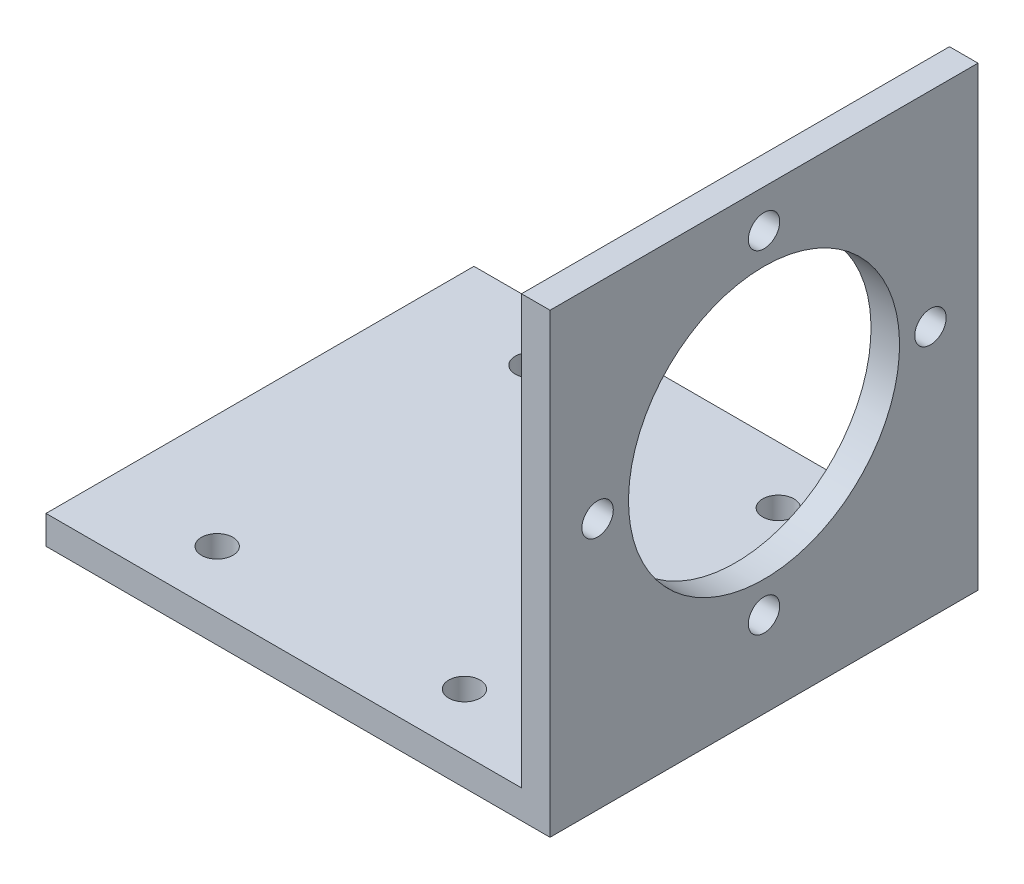
ISO-10303-21;
HEADER;
FILE_DESCRIPTION(('STEP AP214'),'2;1');
FILE_NAME('part.step','',(''),(''),'','','');
FILE_SCHEMA(('AUTOMOTIVE_DESIGN { 1 0 10303 214 1 1 1 1 }'));
ENDSEC;
DATA;
#1=APPLICATION_CONTEXT('core data for automotive mechanical design processes');
#2=APPLICATION_PROTOCOL_DEFINITION('international standard','automotive_design',2000,#1);
#3=PRODUCT_CONTEXT('',#1,'mechanical');
#4=PRODUCT('Part','Part','',(#3));
#5=PRODUCT_RELATED_PRODUCT_CATEGORY('part','',(#4));
#6=PRODUCT_DEFINITION_FORMATION('','',#4);
#7=PRODUCT_DEFINITION_CONTEXT('part definition',#1,'design');
#8=PRODUCT_DEFINITION('design','',#6,#7);
#9=PRODUCT_DEFINITION_SHAPE('','',#8);
#10=(LENGTH_UNIT() NAMED_UNIT(*) SI_UNIT(.MILLI.,.METRE.));
#11=(NAMED_UNIT(*) PLANE_ANGLE_UNIT() SI_UNIT($,.RADIAN.));
#12=(NAMED_UNIT(*) SI_UNIT($,.STERADIAN.) SOLID_ANGLE_UNIT());
#13=UNCERTAINTY_MEASURE_WITH_UNIT(LENGTH_MEASURE(1.E-05),#10,'distance_accuracy_value','');
#14=(GEOMETRIC_REPRESENTATION_CONTEXT(3) GLOBAL_UNCERTAINTY_ASSIGNED_CONTEXT((#13)) GLOBAL_UNIT_ASSIGNED_CONTEXT((#10,
#11,#12)) REPRESENTATION_CONTEXT('',''));
#15=CARTESIAN_POINT('',(0.,0.,0.));
#16=DIRECTION('',(0.,0.,1.));
#17=DIRECTION('',(1.,0.,0.));
#18=AXIS2_PLACEMENT_3D('',#15,#16,#17);
#19=CARTESIAN_POINT('',(50.,48.,45.));
#20=DIRECTION('',(1.,0.,0.));
#21=DIRECTION('',(0.,1.,0.));
#22=AXIS2_PLACEMENT_3D('',#19,#20,#21);
#23=PLANE('',#22);
#24=CARTESIAN_POINT('',(50.,26.4999999999967,22.4999999999944));
#25=DIRECTION('',(1.,0.,0.));
#26=DIRECTION('',(0.,1.,0.));
#27=AXIS2_PLACEMENT_3D('',#24,#25,#26);
#28=CIRCLE('',#27,14.25);
#29=CARTESIAN_POINT('',(50.,40.7499999999967,22.4999999999944));
#30=VERTEX_POINT('',#29);
#31=EDGE_CURVE('E229',#30,#30,#28,.F.);
#32=ORIENTED_EDGE('',*,*,#31,.F.);
#33=EDGE_LOOP('',(#32));
#34=FACE_BOUND('',#33,.T.);
#35=CARTESIAN_POINT('',(50.,43.9999999999933,22.499999999992));
#36=DIRECTION('',(1.,0.,0.));
#37=DIRECTION('',(0.,1.,0.));
#38=AXIS2_PLACEMENT_3D('',#35,#36,#37);
#39=CIRCLE('',#38,1.65);
#40=CARTESIAN_POINT('',(50.,45.6499999999933,22.499999999992));
#41=VERTEX_POINT('',#40);
#42=EDGE_CURVE('E223',#41,#41,#39,.F.);
#43=ORIENTED_EDGE('',*,*,#42,.F.);
#44=EDGE_LOOP('',(#43));
#45=FACE_BOUND('',#44,.T.);
#46=CARTESIAN_POINT('',(50.,26.4999999999967,5.));
#47=DIRECTION('',(1.,0.,0.));
#48=DIRECTION('',(0.,1.,0.));
#49=AXIS2_PLACEMENT_3D('',#46,#47,#48);
#50=CIRCLE('',#49,1.65);
#51=CARTESIAN_POINT('',(50.,28.1499999999967,5.));
#52=VERTEX_POINT('',#51);
#53=EDGE_CURVE('E217',#52,#52,#50,.F.);
#54=ORIENTED_EDGE('',*,*,#53,.F.);
#55=EDGE_LOOP('',(#54));
#56=FACE_BOUND('',#55,.T.);
#57=CARTESIAN_POINT('',(50.,9.00000000000001,22.4999999999921));
#58=DIRECTION('',(1.,0.,0.));
#59=DIRECTION('',(0.,1.,0.));
#60=AXIS2_PLACEMENT_3D('',#57,#58,#59);
#61=CIRCLE('',#60,1.64999999999999);
#62=CARTESIAN_POINT('',(50.,10.65,22.4999999999921));
#63=VERTEX_POINT('',#62);
#64=EDGE_CURVE('E211',#63,#63,#61,.F.);
#65=ORIENTED_EDGE('',*,*,#64,.F.);
#66=EDGE_LOOP('',(#65));
#67=FACE_BOUND('',#66,.T.);
#68=DIRECTION('',(0.,-1.,0.));
#69=VECTOR('',#68,1.);
#70=CARTESIAN_POINT('',(50.,48.,0.));
#71=LINE('',#70,#69);
#72=CARTESIAN_POINT('',(50.,48.,0.));
#73=VERTEX_POINT('',#72);
#74=CARTESIAN_POINT('',(50.,2.99999999999999,0.));
#75=VERTEX_POINT('',#74);
#76=EDGE_CURVE('E75',#73,#75,#71,.T.);
#77=ORIENTED_EDGE('',*,*,#76,.T.);
#78=DIRECTION('',(0.,0.,-1.));
#79=VECTOR('',#78,1.);
#80=CARTESIAN_POINT('',(50.,2.99999999999999,45.));
#81=LINE('',#80,#79);
#82=CARTESIAN_POINT('',(50.,2.99999999999999,45.));
#83=VERTEX_POINT('',#82);
#84=EDGE_CURVE('E112',#83,#75,#81,.T.);
#85=ORIENTED_EDGE('',*,*,#84,.F.);
#86=DIRECTION('',(0.,-1.,0.));
#87=VECTOR('',#86,1.);
#88=CARTESIAN_POINT('',(50.,48.,45.));
#89=LINE('',#88,#87);
#90=CARTESIAN_POINT('',(50.,48.,45.));
#91=VERTEX_POINT('',#90);
#92=EDGE_CURVE('E100',#91,#83,#89,.T.);
#93=ORIENTED_EDGE('',*,*,#92,.F.);
#94=DIRECTION('',(0.,0.,-1.));
#95=VECTOR('',#94,1.);
#96=CARTESIAN_POINT('',(50.,48.,45.));
#97=LINE('',#96,#95);
#98=EDGE_CURVE('E107',#91,#73,#97,.T.);
#99=ORIENTED_EDGE('',*,*,#98,.T.);
#100=EDGE_LOOP('',(#77,#85,#93,#99));
#101=FACE_BOUND('',#100,.T.);
#102=CARTESIAN_POINT('',(50.,26.4999999999967,39.9999999999887));
#103=DIRECTION('',(1.,0.,0.));
#104=DIRECTION('',(0.,1.,0.));
#105=AXIS2_PLACEMENT_3D('',#102,#103,#104);
#106=CIRCLE('',#105,1.65);
#107=CARTESIAN_POINT('',(50.,28.1499999999967,39.9999999999887));
#108=VERTEX_POINT('',#107);
#109=EDGE_CURVE('E206',#108,#108,#106,.F.);
#110=ORIENTED_EDGE('',*,*,#109,.F.);
#111=EDGE_LOOP('',(#110));
#112=FACE_BOUND('',#111,.T.);
#113=ADVANCED_FACE('F35',(#34,#45,#56,#67,#101,#112),#23,.F.);
#114=CARTESIAN_POINT('',(0.,2.99999999999999,45.));
#115=DIRECTION('',(1.,0.,0.));
#116=DIRECTION('',(0.,1.,0.));
#117=AXIS2_PLACEMENT_3D('',#114,#115,#116);
#118=PLANE('',#117);
#119=DIRECTION('',(0.,-1.,0.));
#120=VECTOR('',#119,1.);
#121=CARTESIAN_POINT('',(0.,2.99999999999999,0.));
#122=LINE('',#121,#120);
#123=CARTESIAN_POINT('',(0.,2.99999999999999,0.));
#124=VERTEX_POINT('',#123);
#125=CARTESIAN_POINT('',(0.,0.,0.));
#126=VERTEX_POINT('',#125);
#127=EDGE_CURVE('E120',#124,#126,#122,.T.);
#128=ORIENTED_EDGE('',*,*,#127,.T.);
#129=DIRECTION('',(0.,0.,-1.));
#130=VECTOR('',#129,1.);
#131=CARTESIAN_POINT('',(0.,0.,45.));
#132=LINE('',#131,#130);
#133=CARTESIAN_POINT('',(0.,0.,45.));
#134=VERTEX_POINT('',#133);
#135=EDGE_CURVE('E11',#134,#126,#132,.T.);
#136=ORIENTED_EDGE('',*,*,#135,.F.);
#137=DIRECTION('',(0.,-1.,0.));
#138=VECTOR('',#137,1.);
#139=CARTESIAN_POINT('',(0.,2.99999999999999,45.));
#140=LINE('',#139,#138);
#141=CARTESIAN_POINT('',(0.,2.99999999999999,45.));
#142=VERTEX_POINT('',#141);
#143=EDGE_CURVE('E131',#142,#134,#140,.T.);
#144=ORIENTED_EDGE('',*,*,#143,.F.);
#145=DIRECTION('',(0.,0.,-1.));
#146=VECTOR('',#145,1.);
#147=CARTESIAN_POINT('',(0.,2.99999999999999,45.));
#148=LINE('',#147,#146);
#149=EDGE_CURVE('E116',#142,#124,#148,.T.);
#150=ORIENTED_EDGE('',*,*,#149,.T.);
#151=EDGE_LOOP('',(#128,#136,#144,#150));
#152=FACE_BOUND('',#151,.T.);
#153=ADVANCED_FACE('F37',(#152),#118,.F.);
#154=CARTESIAN_POINT('',(0.,0.,45.));
#155=DIRECTION('',(0.,1.,0.));
#156=DIRECTION('',(0.,0.,1.));
#157=AXIS2_PLACEMENT_3D('',#154,#155,#156);
#158=PLANE('',#157);
#159=CARTESIAN_POINT('',(38.,0.,39.));
#160=DIRECTION('',(0.,1.,0.));
#161=DIRECTION('',(0.,0.,1.));
#162=AXIS2_PLACEMENT_3D('',#159,#160,#161);
#163=CIRCLE('',#162,1.65);
#164=CARTESIAN_POINT('',(38.,0.,40.65));
#165=VERTEX_POINT('',#164);
#166=EDGE_CURVE('E176',#165,#165,#163,.F.);
#167=ORIENTED_EDGE('',*,*,#166,.F.);
#168=EDGE_LOOP('',(#167));
#169=FACE_BOUND('',#168,.T.);
#170=CARTESIAN_POINT('',(12.,0.,39.));
#171=DIRECTION('',(0.,1.,0.));
#172=DIRECTION('',(0.,0.,1.));
#173=AXIS2_PLACEMENT_3D('',#170,#171,#172);
#174=CIRCLE('',#173,1.65);
#175=CARTESIAN_POINT('',(12.,0.,40.65));
#176=VERTEX_POINT('',#175);
#177=EDGE_CURVE('E180',#176,#176,#174,.F.);
#178=ORIENTED_EDGE('',*,*,#177,.F.);
#179=EDGE_LOOP('',(#178));
#180=FACE_BOUND('',#179,.T.);
#181=CARTESIAN_POINT('',(12.,0.,6.));
#182=DIRECTION('',(0.,1.,0.));
#183=DIRECTION('',(0.,0.,1.));
#184=AXIS2_PLACEMENT_3D('',#181,#182,#183);
#185=CIRCLE('',#184,1.65);
#186=CARTESIAN_POINT('',(12.,0.,7.65));
#187=VERTEX_POINT('',#186);
#188=EDGE_CURVE('E184',#187,#187,#185,.F.);
#189=ORIENTED_EDGE('',*,*,#188,.F.);
#190=EDGE_LOOP('',(#189));
#191=FACE_BOUND('',#190,.T.);
#192=CARTESIAN_POINT('',(38.,0.,6.));
#193=DIRECTION('',(0.,1.,0.));
#194=DIRECTION('',(0.,0.,1.));
#195=AXIS2_PLACEMENT_3D('',#192,#193,#194);
#196=CIRCLE('',#195,1.65);
#197=CARTESIAN_POINT('',(38.,0.,7.65));
#198=VERTEX_POINT('',#197);
#199=EDGE_CURVE('E124',#198,#198,#196,.F.);
#200=ORIENTED_EDGE('',*,*,#199,.F.);
#201=EDGE_LOOP('',(#200));
#202=FACE_BOUND('',#201,.T.);
#203=DIRECTION('',(1.,0.,0.));
#204=VECTOR('',#203,1.);
#205=CARTESIAN_POINT('',(0.,0.,0.));
#206=LINE('',#205,#204);
#207=CARTESIAN_POINT('',(53.,0.,0.));
#208=VERTEX_POINT('',#207);
#209=EDGE_CURVE('E123',#126,#208,#206,.T.);
#210=ORIENTED_EDGE('',*,*,#209,.T.);
#211=DIRECTION('',(0.,0.,-1.));
#212=VECTOR('',#211,1.);
#213=CARTESIAN_POINT('',(53.,0.,45.));
#214=LINE('',#213,#212);
#215=CARTESIAN_POINT('',(53.,0.,45.));
#216=VERTEX_POINT('',#215);
#217=EDGE_CURVE('E44',#216,#208,#214,.T.);
#218=ORIENTED_EDGE('',*,*,#217,.F.);
#219=DIRECTION('',(1.,0.,0.));
#220=VECTOR('',#219,1.);
#221=CARTESIAN_POINT('',(0.,0.,45.));
#222=LINE('',#221,#220);
#223=EDGE_CURVE('E89',#134,#216,#222,.T.);
#224=ORIENTED_EDGE('',*,*,#223,.F.);
#225=ORIENTED_EDGE('',*,*,#135,.T.);
#226=EDGE_LOOP('',(#210,#218,#224,#225));
#227=FACE_BOUND('',#226,.T.);
#228=ADVANCED_FACE('F163',(#169,#180,#191,#202,#227),#158,.F.);
#229=CARTESIAN_POINT('',(53.,0.,45.));
#230=DIRECTION('',(-1.,0.,0.));
#231=DIRECTION('',(0.,-1.,0.));
#232=AXIS2_PLACEMENT_3D('',#229,#230,#231);
#233=PLANE('',#232);
#234=CARTESIAN_POINT('',(53.,26.4999999999967,22.4999999999944));
#235=DIRECTION('',(1.,0.,0.));
#236=DIRECTION('',(0.,1.,0.));
#237=AXIS2_PLACEMENT_3D('',#234,#235,#236);
#238=CIRCLE('',#237,14.25);
#239=CARTESIAN_POINT('',(53.,40.7499999999967,22.4999999999944));
#240=VERTEX_POINT('',#239);
#241=EDGE_CURVE('E234',#240,#240,#238,.T.);
#242=ORIENTED_EDGE('',*,*,#241,.F.);
#243=EDGE_LOOP('',(#242));
#244=FACE_BOUND('',#243,.T.);
#245=CARTESIAN_POINT('',(53.,43.9999999999933,22.499999999992));
#246=DIRECTION('',(1.,0.,0.));
#247=DIRECTION('',(0.,0.,-1.));
#248=AXIS2_PLACEMENT_3D('',#245,#246,#247);
#249=CIRCLE('',#248,1.64999999999999);
#250=CARTESIAN_POINT('',(53.,43.9999999999933,20.849999999992));
#251=VERTEX_POINT('',#250);
#252=EDGE_CURVE('E226',#251,#251,#249,.T.);
#253=ORIENTED_EDGE('',*,*,#252,.F.);
#254=EDGE_LOOP('',(#253));
#255=FACE_BOUND('',#254,.T.);
#256=CARTESIAN_POINT('',(53.,26.4999999999967,5.));
#257=DIRECTION('',(1.,0.,0.));
#258=DIRECTION('',(0.,0.,-1.));
#259=AXIS2_PLACEMENT_3D('',#256,#257,#258);
#260=CIRCLE('',#259,1.64999999999999);
#261=CARTESIAN_POINT('',(53.,26.4999999999967,3.35000000000001));
#262=VERTEX_POINT('',#261);
#263=EDGE_CURVE('E220',#262,#262,#260,.T.);
#264=ORIENTED_EDGE('',*,*,#263,.F.);
#265=EDGE_LOOP('',(#264));
#266=FACE_BOUND('',#265,.T.);
#267=CARTESIAN_POINT('',(53.,9.00000000000001,22.4999999999921));
#268=DIRECTION('',(1.,0.,0.));
#269=DIRECTION('',(0.,0.,-1.));
#270=AXIS2_PLACEMENT_3D('',#267,#268,#269);
#271=CIRCLE('',#270,1.64999999999999);
#272=CARTESIAN_POINT('',(53.,9.00000000000001,20.8499999999921));
#273=VERTEX_POINT('',#272);
#274=EDGE_CURVE('E214',#273,#273,#271,.T.);
#275=ORIENTED_EDGE('',*,*,#274,.F.);
#276=EDGE_LOOP('',(#275));
#277=FACE_BOUND('',#276,.T.);
#278=CARTESIAN_POINT('',(53.,26.4999999999967,39.9999999999887));
#279=DIRECTION('',(1.,0.,0.));
#280=DIRECTION('',(0.,0.,-1.));
#281=AXIS2_PLACEMENT_3D('',#278,#279,#280);
#282=CIRCLE('',#281,1.64999999999999);
#283=CARTESIAN_POINT('',(53.,26.4999999999967,38.3499999999887));
#284=VERTEX_POINT('',#283);
#285=EDGE_CURVE('E208',#284,#284,#282,.T.);
#286=ORIENTED_EDGE('',*,*,#285,.F.);
#287=EDGE_LOOP('',(#286));
#288=FACE_BOUND('',#287,.T.);
#289=DIRECTION('',(0.,1.,0.));
#290=VECTOR('',#289,1.);
#291=CARTESIAN_POINT('',(53.,0.,0.));
#292=LINE('',#291,#290);
#293=CARTESIAN_POINT('',(53.,48.,0.));
#294=VERTEX_POINT('',#293);
#295=EDGE_CURVE('E126',#208,#294,#292,.T.);
#296=ORIENTED_EDGE('',*,*,#295,.T.);
#297=DIRECTION('',(0.,0.,-1.));
#298=VECTOR('',#297,1.);
#299=CARTESIAN_POINT('',(53.,48.,45.));
#300=LINE('',#299,#298);
#301=CARTESIAN_POINT('',(53.,48.,45.));
#302=VERTEX_POINT('',#301);
#303=EDGE_CURVE('E111',#302,#294,#300,.T.);
#304=ORIENTED_EDGE('',*,*,#303,.F.);
#305=DIRECTION('',(0.,1.,0.));
#306=VECTOR('',#305,1.);
#307=CARTESIAN_POINT('',(53.,0.,45.));
#308=LINE('',#307,#306);
#309=EDGE_CURVE('E102',#216,#302,#308,.T.);
#310=ORIENTED_EDGE('',*,*,#309,.F.);
#311=ORIENTED_EDGE('',*,*,#217,.T.);
#312=EDGE_LOOP('',(#296,#304,#310,#311));
#313=FACE_BOUND('',#312,.T.);
#314=ADVANCED_FACE('F137',(#244,#255,#266,#277,#288,#313),#233,.F.);
#315=CARTESIAN_POINT('',(53.,48.,45.));
#316=DIRECTION('',(0.,-1.,0.));
#317=DIRECTION('',(0.,0.,-1.));
#318=AXIS2_PLACEMENT_3D('',#315,#316,#317);
#319=PLANE('',#318);
#320=DIRECTION('',(-1.,0.,0.));
#321=VECTOR('',#320,1.);
#322=CARTESIAN_POINT('',(53.,48.,0.));
#323=LINE('',#322,#321);
#324=EDGE_CURVE('E110',#294,#73,#323,.T.);
#325=ORIENTED_EDGE('',*,*,#324,.T.);
#326=ORIENTED_EDGE('',*,*,#98,.F.);
#327=DIRECTION('',(-1.,0.,0.));
#328=VECTOR('',#327,1.);
#329=CARTESIAN_POINT('',(53.,48.,45.));
#330=LINE('',#329,#328);
#331=EDGE_CURVE('E96',#302,#91,#330,.T.);
#332=ORIENTED_EDGE('',*,*,#331,.F.);
#333=ORIENTED_EDGE('',*,*,#303,.T.);
#334=EDGE_LOOP('',(#325,#326,#332,#333));
#335=FACE_BOUND('',#334,.T.);
#336=ADVANCED_FACE('F108',(#335),#319,.F.);
#337=CARTESIAN_POINT('',(50.,2.99999999999999,45.));
#338=DIRECTION('',(0.,-1.,0.));
#339=DIRECTION('',(1.,0.,0.));
#340=AXIS2_PLACEMENT_3D('',#337,#338,#339);
#341=PLANE('',#340);
#342=CARTESIAN_POINT('',(38.,2.99999999999999,39.));
#343=DIRECTION('',(0.,1.,0.));
#344=DIRECTION('',(0.,0.,1.));
#345=AXIS2_PLACEMENT_3D('',#342,#343,#344);
#346=CIRCLE('',#345,1.65);
#347=CARTESIAN_POINT('',(38.,2.99999999999999,40.65));
#348=VERTEX_POINT('',#347);
#349=EDGE_CURVE('E203',#348,#348,#346,.T.);
#350=ORIENTED_EDGE('',*,*,#349,.F.);
#351=EDGE_LOOP('',(#350));
#352=FACE_BOUND('',#351,.T.);
#353=CARTESIAN_POINT('',(12.,2.99999999999999,39.));
#354=DIRECTION('',(0.,1.,0.));
#355=DIRECTION('',(0.,0.,1.));
#356=AXIS2_PLACEMENT_3D('',#353,#354,#355);
#357=CIRCLE('',#356,1.65);
#358=CARTESIAN_POINT('',(12.,2.99999999999999,40.65));
#359=VERTEX_POINT('',#358);
#360=EDGE_CURVE('E199',#359,#359,#357,.T.);
#361=ORIENTED_EDGE('',*,*,#360,.F.);
#362=EDGE_LOOP('',(#361));
#363=FACE_BOUND('',#362,.T.);
#364=CARTESIAN_POINT('',(12.,2.99999999999999,6.));
#365=DIRECTION('',(0.,1.,0.));
#366=DIRECTION('',(0.,0.,1.));
#367=AXIS2_PLACEMENT_3D('',#364,#365,#366);
#368=CIRCLE('',#367,1.65);
#369=CARTESIAN_POINT('',(12.,2.99999999999999,7.65));
#370=VERTEX_POINT('',#369);
#371=EDGE_CURVE('E193',#370,#370,#368,.T.);
#372=ORIENTED_EDGE('',*,*,#371,.F.);
#373=EDGE_LOOP('',(#372));
#374=FACE_BOUND('',#373,.T.);
#375=CARTESIAN_POINT('',(38.,2.99999999999999,6.));
#376=DIRECTION('',(0.,1.,0.));
#377=DIRECTION('',(0.,0.,1.));
#378=AXIS2_PLACEMENT_3D('',#375,#376,#377);
#379=CIRCLE('',#378,1.65);
#380=CARTESIAN_POINT('',(38.,2.99999999999999,7.65));
#381=VERTEX_POINT('',#380);
#382=EDGE_CURVE('E188',#381,#381,#379,.T.);
#383=ORIENTED_EDGE('',*,*,#382,.F.);
#384=EDGE_LOOP('',(#383));
#385=FACE_BOUND('',#384,.T.);
#386=DIRECTION('',(-1.,0.,0.));
#387=VECTOR('',#386,1.);
#388=CARTESIAN_POINT('',(50.,2.99999999999999,0.));
#389=LINE('',#388,#387);
#390=EDGE_CURVE('E81',#75,#124,#389,.T.);
#391=ORIENTED_EDGE('',*,*,#390,.T.);
#392=ORIENTED_EDGE('',*,*,#149,.F.);
#393=DIRECTION('',(-1.,0.,0.));
#394=VECTOR('',#393,1.);
#395=CARTESIAN_POINT('',(50.,2.99999999999999,45.));
#396=LINE('',#395,#394);
#397=EDGE_CURVE('E52',#83,#142,#396,.T.);
#398=ORIENTED_EDGE('',*,*,#397,.F.);
#399=ORIENTED_EDGE('',*,*,#84,.T.);
#400=EDGE_LOOP('',(#391,#392,#398,#399));
#401=FACE_BOUND('',#400,.T.);
#402=ADVANCED_FACE('F144',(#352,#363,#374,#385,#401),#341,.F.);
#403=CARTESIAN_POINT('',(0.,0.,45.));
#404=DIRECTION('',(0.,0.,1.));
#405=DIRECTION('',(1.,0.,0.));
#406=AXIS2_PLACEMENT_3D('',#403,#404,#405);
#407=PLANE('',#406);
#408=ORIENTED_EDGE('',*,*,#143,.T.);
#409=ORIENTED_EDGE('',*,*,#223,.T.);
#410=ORIENTED_EDGE('',*,*,#309,.T.);
#411=ORIENTED_EDGE('',*,*,#331,.T.);
#412=ORIENTED_EDGE('',*,*,#92,.T.);
#413=ORIENTED_EDGE('',*,*,#397,.T.);
#414=EDGE_LOOP('',(#408,#409,#410,#411,#412,#413));
#415=FACE_BOUND('',#414,.T.);
#416=ADVANCED_FACE('F98',(#415),#407,.T.);
#417=CARTESIAN_POINT('',(0.,0.,0.));
#418=DIRECTION('',(0.,0.,1.));
#419=DIRECTION('',(1.,0.,0.));
#420=AXIS2_PLACEMENT_3D('',#417,#418,#419);
#421=PLANE('',#420);
#422=ORIENTED_EDGE('',*,*,#127,.F.);
#423=ORIENTED_EDGE('',*,*,#390,.F.);
#424=ORIENTED_EDGE('',*,*,#76,.F.);
#425=ORIENTED_EDGE('',*,*,#324,.F.);
#426=ORIENTED_EDGE('',*,*,#295,.F.);
#427=ORIENTED_EDGE('',*,*,#209,.F.);
#428=EDGE_LOOP('',(#422,#423,#424,#425,#426,#427));
#429=FACE_BOUND('',#428,.T.);
#430=ADVANCED_FACE('F140',(#429),#421,.F.);
#431=CARTESIAN_POINT('',(38.,2.99999999999999,6.));
#432=DIRECTION('',(0.,1.,0.));
#433=DIRECTION('',(0.,0.,1.));
#434=AXIS2_PLACEMENT_3D('',#431,#432,#433);
#435=CYLINDRICAL_SURFACE('',#434,1.65);
#436=ORIENTED_EDGE('',*,*,#199,.T.);
#437=EDGE_LOOP('',(#436));
#438=FACE_BOUND('',#437,.T.);
#439=ORIENTED_EDGE('',*,*,#382,.T.);
#440=EDGE_LOOP('',(#439));
#441=FACE_BOUND('',#440,.T.);
#442=ADVANCED_FACE('F272',(#438,#441),#435,.F.);
#443=CARTESIAN_POINT('',(12.,2.99999999999999,6.));
#444=DIRECTION('',(0.,1.,0.));
#445=DIRECTION('',(0.,0.,1.));
#446=AXIS2_PLACEMENT_3D('',#443,#444,#445);
#447=CYLINDRICAL_SURFACE('',#446,1.65);
#448=ORIENTED_EDGE('',*,*,#188,.T.);
#449=EDGE_LOOP('',(#448));
#450=FACE_BOUND('',#449,.T.);
#451=ORIENTED_EDGE('',*,*,#371,.T.);
#452=EDGE_LOOP('',(#451));
#453=FACE_BOUND('',#452,.T.);
#454=ADVANCED_FACE('F268',(#450,#453),#447,.F.);
#455=CARTESIAN_POINT('',(12.,2.99999999999999,39.));
#456=DIRECTION('',(0.,1.,0.));
#457=DIRECTION('',(0.,0.,1.));
#458=AXIS2_PLACEMENT_3D('',#455,#456,#457);
#459=CYLINDRICAL_SURFACE('',#458,1.65);
#460=ORIENTED_EDGE('',*,*,#177,.T.);
#461=EDGE_LOOP('',(#460));
#462=FACE_BOUND('',#461,.T.);
#463=ORIENTED_EDGE('',*,*,#360,.T.);
#464=EDGE_LOOP('',(#463));
#465=FACE_BOUND('',#464,.T.);
#466=ADVANCED_FACE('F261',(#462,#465),#459,.F.);
#467=CARTESIAN_POINT('',(38.,2.99999999999999,39.));
#468=DIRECTION('',(0.,1.,0.));
#469=DIRECTION('',(0.,0.,1.));
#470=AXIS2_PLACEMENT_3D('',#467,#468,#469);
#471=CYLINDRICAL_SURFACE('',#470,1.65);
#472=ORIENTED_EDGE('',*,*,#166,.T.);
#473=EDGE_LOOP('',(#472));
#474=FACE_BOUND('',#473,.T.);
#475=ORIENTED_EDGE('',*,*,#349,.T.);
#476=EDGE_LOOP('',(#475));
#477=FACE_BOUND('',#476,.T.);
#478=ADVANCED_FACE('F251',(#474,#477),#471,.F.);
#479=CARTESIAN_POINT('',(53.,26.4999999999967,39.9999999999887));
#480=DIRECTION('',(1.,0.,0.));
#481=DIRECTION('',(0.,0.,-1.));
#482=AXIS2_PLACEMENT_3D('',#479,#480,#481);
#483=CYLINDRICAL_SURFACE('',#482,1.65);
#484=ORIENTED_EDGE('',*,*,#109,.T.);
#485=EDGE_LOOP('',(#484));
#486=FACE_BOUND('',#485,.T.);
#487=ORIENTED_EDGE('',*,*,#285,.T.);
#488=EDGE_LOOP('',(#487));
#489=FACE_BOUND('',#488,.T.);
#490=ADVANCED_FACE('F248',(#486,#489),#483,.F.);
#491=CARTESIAN_POINT('',(53.,9.00000000000001,22.4999999999921));
#492=DIRECTION('',(1.,0.,0.));
#493=DIRECTION('',(0.,0.,-1.));
#494=AXIS2_PLACEMENT_3D('',#491,#492,#493);
#495=CYLINDRICAL_SURFACE('',#494,1.64999999999999);
#496=ORIENTED_EDGE('',*,*,#64,.T.);
#497=EDGE_LOOP('',(#496));
#498=FACE_BOUND('',#497,.T.);
#499=ORIENTED_EDGE('',*,*,#274,.T.);
#500=EDGE_LOOP('',(#499));
#501=FACE_BOUND('',#500,.T.);
#502=ADVANCED_FACE('F250',(#498,#501),#495,.F.);
#503=CARTESIAN_POINT('',(53.,26.4999999999967,5.));
#504=DIRECTION('',(1.,0.,0.));
#505=DIRECTION('',(0.,0.,-1.));
#506=AXIS2_PLACEMENT_3D('',#503,#504,#505);
#507=CYLINDRICAL_SURFACE('',#506,1.65);
#508=ORIENTED_EDGE('',*,*,#53,.T.);
#509=EDGE_LOOP('',(#508));
#510=FACE_BOUND('',#509,.T.);
#511=ORIENTED_EDGE('',*,*,#263,.T.);
#512=EDGE_LOOP('',(#511));
#513=FACE_BOUND('',#512,.T.);
#514=ADVANCED_FACE('F258',(#510,#513),#507,.F.);
#515=CARTESIAN_POINT('',(53.,43.9999999999933,22.499999999992));
#516=DIRECTION('',(1.,0.,0.));
#517=DIRECTION('',(0.,0.,-1.));
#518=AXIS2_PLACEMENT_3D('',#515,#516,#517);
#519=CYLINDRICAL_SURFACE('',#518,1.65);
#520=ORIENTED_EDGE('',*,*,#42,.T.);
#521=EDGE_LOOP('',(#520));
#522=FACE_BOUND('',#521,.T.);
#523=ORIENTED_EDGE('',*,*,#252,.T.);
#524=EDGE_LOOP('',(#523));
#525=FACE_BOUND('',#524,.T.);
#526=ADVANCED_FACE('F325',(#522,#525),#519,.F.);
#527=CARTESIAN_POINT('',(9.69491347236678,26.4999999999967,22.4999999999944));
#528=DIRECTION('',(1.,0.,0.));
#529=DIRECTION('',(0.,1.,0.));
#530=AXIS2_PLACEMENT_3D('',#527,#528,#529);
#531=CYLINDRICAL_SURFACE('',#530,14.25);
#532=ORIENTED_EDGE('',*,*,#31,.T.);
#533=EDGE_LOOP('',(#532));
#534=FACE_BOUND('',#533,.T.);
#535=ORIENTED_EDGE('',*,*,#241,.T.);
#536=EDGE_LOOP('',(#535));
#537=FACE_BOUND('',#536,.T.);
#538=ADVANCED_FACE('F238',(#534,#537),#531,.F.);
#539=CLOSED_SHELL('',(#113,#153,#228,#314,#336,#402,#416,#430,#442,#454,#466,#478,#490,#502,
#514,#526,#538));
#540=MANIFOLD_SOLID_BREP('B2',#539);
#541=ADVANCED_BREP_SHAPE_REPRESENTATION('',(#18,#540),#14);
#542=SHAPE_DEFINITION_REPRESENTATION(#9,#541);
ENDSEC;
END-ISO-10303-21;
